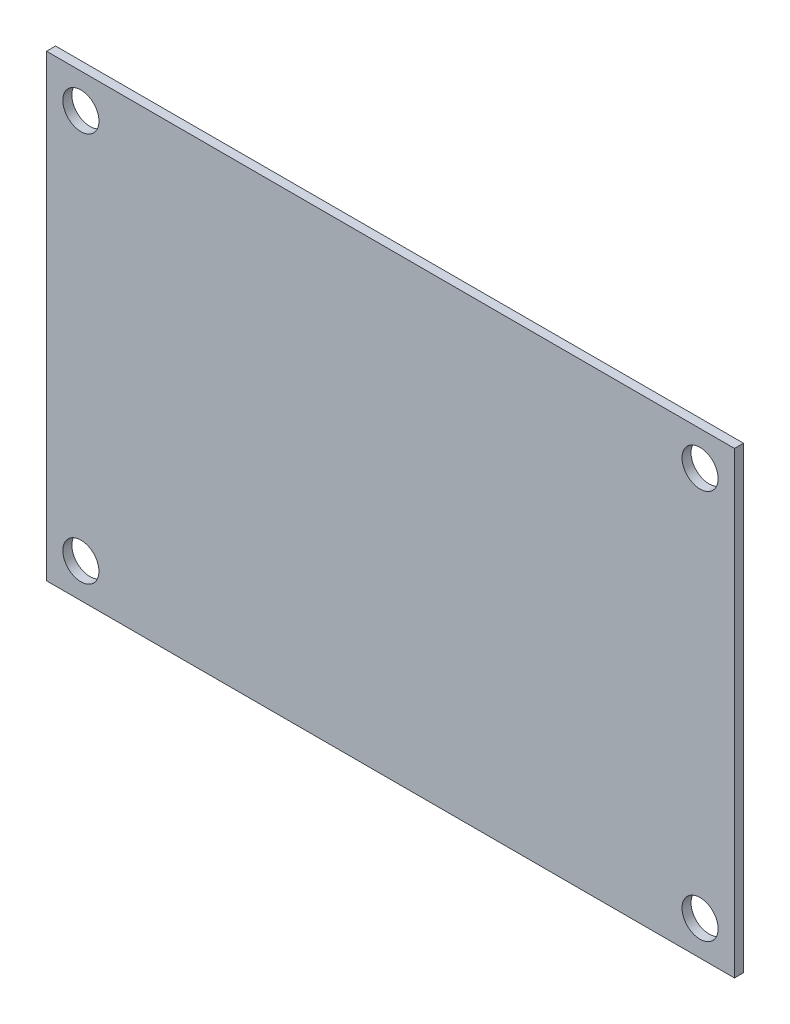
ISO-10303-21;
HEADER;
FILE_DESCRIPTION(('STEP AP214'),'2;1');
FILE_NAME('part.step','',(''),(''),'','','');
FILE_SCHEMA(('AUTOMOTIVE_DESIGN { 1 0 10303 214 1 1 1 1 }'));
ENDSEC;
DATA;
#1=APPLICATION_CONTEXT('core data for automotive mechanical design processes');
#2=APPLICATION_PROTOCOL_DEFINITION('international standard','automotive_design',2000,#1);
#3=PRODUCT_CONTEXT('',#1,'mechanical');
#4=PRODUCT('Part','Part','',(#3));
#5=PRODUCT_RELATED_PRODUCT_CATEGORY('part','',(#4));
#6=PRODUCT_DEFINITION_FORMATION('','',#4);
#7=PRODUCT_DEFINITION_CONTEXT('part definition',#1,'design');
#8=PRODUCT_DEFINITION('design','',#6,#7);
#9=PRODUCT_DEFINITION_SHAPE('','',#8);
#10=(LENGTH_UNIT() NAMED_UNIT(*) SI_UNIT(.MILLI.,.METRE.));
#11=(NAMED_UNIT(*) PLANE_ANGLE_UNIT() SI_UNIT($,.RADIAN.));
#12=(NAMED_UNIT(*) SI_UNIT($,.STERADIAN.) SOLID_ANGLE_UNIT());
#13=UNCERTAINTY_MEASURE_WITH_UNIT(LENGTH_MEASURE(1.E-05),#10,'distance_accuracy_value','');
#14=(GEOMETRIC_REPRESENTATION_CONTEXT(3) GLOBAL_UNCERTAINTY_ASSIGNED_CONTEXT((#13)) GLOBAL_UNIT_ASSIGNED_CONTEXT((#10,
#11,#12)) REPRESENTATION_CONTEXT('',''));
#15=CARTESIAN_POINT('',(0.,0.,0.));
#16=DIRECTION('',(0.,0.,1.));
#17=DIRECTION('',(1.,0.,0.));
#18=AXIS2_PLACEMENT_3D('',#15,#16,#17);
#19=CARTESIAN_POINT('',(0.,0.,1.));
#20=DIRECTION('',(0.,0.,1.));
#21=DIRECTION('',(1.,0.,0.));
#22=AXIS2_PLACEMENT_3D('',#19,#20,#21);
#23=PLANE('',#22);
#24=CARTESIAN_POINT('',(-34.29,-21.59,1.));
#25=DIRECTION('',(0.,0.,1.));
#26=DIRECTION('',(-1.,0.,0.));
#27=AXIS2_PLACEMENT_3D('',#24,#25,#26);
#28=CIRCLE('',#27,2.);
#29=CARTESIAN_POINT('',(-36.29,-21.59,1.));
#30=VERTEX_POINT('',#29);
#31=EDGE_CURVE('E124',#30,#30,#28,.T.);
#32=ORIENTED_EDGE('',*,*,#31,.F.);
#33=EDGE_LOOP('',(#32));
#34=FACE_BOUND('',#33,.T.);
#35=CARTESIAN_POINT('',(-34.29,21.59,1.));
#36=DIRECTION('',(0.,0.,1.));
#37=DIRECTION('',(1.,0.,0.));
#38=AXIS2_PLACEMENT_3D('',#35,#36,#37);
#39=CIRCLE('',#38,2.);
#40=CARTESIAN_POINT('',(-32.29,21.59,1.));
#41=VERTEX_POINT('',#40);
#42=EDGE_CURVE('E103',#41,#41,#39,.T.);
#43=ORIENTED_EDGE('',*,*,#42,.F.);
#44=EDGE_LOOP('',(#43));
#45=FACE_BOUND('',#44,.T.);
#46=DIRECTION('',(0.,-1.,0.));
#47=VECTOR('',#46,1.);
#48=CARTESIAN_POINT('',(-38.1,-25.4,1.));
#49=LINE('',#48,#47);
#50=CARTESIAN_POINT('',(-38.1,25.4,1.));
#51=VERTEX_POINT('',#50);
#52=CARTESIAN_POINT('',(-38.1,-25.4,1.));
#53=VERTEX_POINT('',#52);
#54=EDGE_CURVE('E88',#51,#53,#49,.T.);
#55=ORIENTED_EDGE('',*,*,#54,.T.);
#56=DIRECTION('',(1.,0.,0.));
#57=VECTOR('',#56,1.);
#58=CARTESIAN_POINT('',(38.1,-25.4,1.));
#59=LINE('',#58,#57);
#60=CARTESIAN_POINT('',(38.1,-25.4,1.));
#61=VERTEX_POINT('',#60);
#62=EDGE_CURVE('E83',#53,#61,#59,.T.);
#63=ORIENTED_EDGE('',*,*,#62,.T.);
#64=DIRECTION('',(0.,1.,0.));
#65=VECTOR('',#64,1.);
#66=CARTESIAN_POINT('',(38.1,-25.4,1.));
#67=LINE('',#66,#65);
#68=CARTESIAN_POINT('',(38.1,25.4,1.));
#69=VERTEX_POINT('',#68);
#70=EDGE_CURVE('E86',#61,#69,#67,.T.);
#71=ORIENTED_EDGE('',*,*,#70,.T.);
#72=DIRECTION('',(-1.,0.,0.));
#73=VECTOR('',#72,1.);
#74=CARTESIAN_POINT('',(38.1,25.4,1.));
#75=LINE('',#74,#73);
#76=EDGE_CURVE('E53',#69,#51,#75,.T.);
#77=ORIENTED_EDGE('',*,*,#76,.T.);
#78=EDGE_LOOP('',(#55,#63,#71,#77));
#79=FACE_BOUND('',#78,.T.);
#80=CARTESIAN_POINT('',(34.29,21.59,1.));
#81=DIRECTION('',(0.,0.,1.));
#82=DIRECTION('',(-1.,0.,0.));
#83=AXIS2_PLACEMENT_3D('',#80,#81,#82);
#84=CIRCLE('',#83,2.);
#85=CARTESIAN_POINT('',(32.29,21.59,1.));
#86=VERTEX_POINT('',#85);
#87=EDGE_CURVE('E118',#86,#86,#84,.T.);
#88=ORIENTED_EDGE('',*,*,#87,.F.);
#89=EDGE_LOOP('',(#88));
#90=FACE_BOUND('',#89,.T.);
#91=CARTESIAN_POINT('',(34.29,-21.59,1.));
#92=DIRECTION('',(0.,0.,1.));
#93=DIRECTION('',(1.,0.,0.));
#94=AXIS2_PLACEMENT_3D('',#91,#92,#93);
#95=CIRCLE('',#94,2.);
#96=CARTESIAN_POINT('',(36.29,-21.59,1.));
#97=VERTEX_POINT('',#96);
#98=EDGE_CURVE('E130',#97,#97,#95,.T.);
#99=ORIENTED_EDGE('',*,*,#98,.F.);
#100=EDGE_LOOP('',(#99));
#101=FACE_BOUND('',#100,.T.);
#102=ADVANCED_FACE('F36',(#34,#45,#79,#90,#101),#23,.T.);
#103=CARTESIAN_POINT('',(0.,0.,0.));
#104=DIRECTION('',(0.,0.,1.));
#105=DIRECTION('',(1.,0.,0.));
#106=AXIS2_PLACEMENT_3D('',#103,#104,#105);
#107=PLANE('',#106);
#108=DIRECTION('',(0.,-1.,0.));
#109=VECTOR('',#108,1.);
#110=CARTESIAN_POINT('',(-38.1,-25.4,0.));
#111=LINE('',#110,#109);
#112=CARTESIAN_POINT('',(-38.1,25.4,0.));
#113=VERTEX_POINT('',#112);
#114=CARTESIAN_POINT('',(-38.1,-25.4,0.));
#115=VERTEX_POINT('',#114);
#116=EDGE_CURVE('E100',#113,#115,#111,.T.);
#117=ORIENTED_EDGE('',*,*,#116,.F.);
#118=DIRECTION('',(-1.,0.,0.));
#119=VECTOR('',#118,1.);
#120=CARTESIAN_POINT('',(38.1,25.4,0.));
#121=LINE('',#120,#119);
#122=CARTESIAN_POINT('',(38.1,25.4,0.));
#123=VERTEX_POINT('',#122);
#124=EDGE_CURVE('E76',#123,#113,#121,.T.);
#125=ORIENTED_EDGE('',*,*,#124,.F.);
#126=DIRECTION('',(0.,1.,0.));
#127=VECTOR('',#126,1.);
#128=CARTESIAN_POINT('',(38.1,-25.4,0.));
#129=LINE('',#128,#127);
#130=CARTESIAN_POINT('',(38.1,-25.4,0.));
#131=VERTEX_POINT('',#130);
#132=EDGE_CURVE('E70',#131,#123,#129,.T.);
#133=ORIENTED_EDGE('',*,*,#132,.F.);
#134=DIRECTION('',(1.,0.,0.));
#135=VECTOR('',#134,1.);
#136=CARTESIAN_POINT('',(38.1,-25.4,0.));
#137=LINE('',#136,#135);
#138=EDGE_CURVE('E92',#115,#131,#137,.T.);
#139=ORIENTED_EDGE('',*,*,#138,.F.);
#140=EDGE_LOOP('',(#117,#125,#133,#139));
#141=FACE_BOUND('',#140,.T.);
#142=CARTESIAN_POINT('',(-34.29,21.59,0.));
#143=DIRECTION('',(0.,0.,1.));
#144=DIRECTION('',(1.,0.,0.));
#145=AXIS2_PLACEMENT_3D('',#142,#143,#144);
#146=CIRCLE('',#145,2.);
#147=CARTESIAN_POINT('',(-32.29,21.59,0.));
#148=VERTEX_POINT('',#147);
#149=EDGE_CURVE('E115',#148,#148,#146,.T.);
#150=ORIENTED_EDGE('',*,*,#149,.T.);
#151=EDGE_LOOP('',(#150));
#152=FACE_BOUND('',#151,.T.);
#153=CARTESIAN_POINT('',(34.29,21.59,0.));
#154=DIRECTION('',(0.,0.,1.));
#155=DIRECTION('',(-1.,0.,0.));
#156=AXIS2_PLACEMENT_3D('',#153,#154,#155);
#157=CIRCLE('',#156,2.);
#158=CARTESIAN_POINT('',(32.29,21.59,0.));
#159=VERTEX_POINT('',#158);
#160=EDGE_CURVE('E121',#159,#159,#157,.T.);
#161=ORIENTED_EDGE('',*,*,#160,.T.);
#162=EDGE_LOOP('',(#161));
#163=FACE_BOUND('',#162,.T.);
#164=CARTESIAN_POINT('',(-34.29,-21.59,0.));
#165=DIRECTION('',(0.,0.,1.));
#166=DIRECTION('',(-1.,0.,0.));
#167=AXIS2_PLACEMENT_3D('',#164,#165,#166);
#168=CIRCLE('',#167,2.);
#169=CARTESIAN_POINT('',(-36.29,-21.59,0.));
#170=VERTEX_POINT('',#169);
#171=EDGE_CURVE('E127',#170,#170,#168,.T.);
#172=ORIENTED_EDGE('',*,*,#171,.T.);
#173=EDGE_LOOP('',(#172));
#174=FACE_BOUND('',#173,.T.);
#175=CARTESIAN_POINT('',(34.29,-21.59,0.));
#176=DIRECTION('',(0.,0.,1.));
#177=DIRECTION('',(1.,0.,0.));
#178=AXIS2_PLACEMENT_3D('',#175,#176,#177);
#179=CIRCLE('',#178,2.);
#180=CARTESIAN_POINT('',(36.29,-21.59,0.));
#181=VERTEX_POINT('',#180);
#182=EDGE_CURVE('E133',#181,#181,#179,.T.);
#183=ORIENTED_EDGE('',*,*,#182,.T.);
#184=EDGE_LOOP('',(#183));
#185=FACE_BOUND('',#184,.T.);
#186=ADVANCED_FACE('F111',(#141,#152,#163,#174,#185),#107,.F.);
#187=CARTESIAN_POINT('',(-38.1,-25.4,1.));
#188=DIRECTION('',(1.,0.,0.));
#189=DIRECTION('',(0.,0.,-1.));
#190=AXIS2_PLACEMENT_3D('',#187,#188,#189);
#191=PLANE('',#190);
#192=ORIENTED_EDGE('',*,*,#116,.T.);
#193=DIRECTION('',(0.,0.,-1.));
#194=VECTOR('',#193,1.);
#195=CARTESIAN_POINT('',(-38.1,-25.4,1.));
#196=LINE('',#195,#194);
#197=EDGE_CURVE('E11',#53,#115,#196,.T.);
#198=ORIENTED_EDGE('',*,*,#197,.F.);
#199=ORIENTED_EDGE('',*,*,#54,.F.);
#200=DIRECTION('',(0.,0.,-1.));
#201=VECTOR('',#200,1.);
#202=CARTESIAN_POINT('',(-38.1,25.4,1.));
#203=LINE('',#202,#201);
#204=EDGE_CURVE('E96',#51,#113,#203,.T.);
#205=ORIENTED_EDGE('',*,*,#204,.T.);
#206=EDGE_LOOP('',(#192,#198,#199,#205));
#207=FACE_BOUND('',#206,.T.);
#208=ADVANCED_FACE('F38',(#207),#191,.F.);
#209=CARTESIAN_POINT('',(38.1,-25.4,1.));
#210=DIRECTION('',(0.,1.,0.));
#211=DIRECTION('',(-1.,0.,0.));
#212=AXIS2_PLACEMENT_3D('',#209,#210,#211);
#213=PLANE('',#212);
#214=ORIENTED_EDGE('',*,*,#138,.T.);
#215=DIRECTION('',(0.,0.,-1.));
#216=VECTOR('',#215,1.);
#217=CARTESIAN_POINT('',(38.1,-25.4,1.));
#218=LINE('',#217,#216);
#219=EDGE_CURVE('E45',#61,#131,#218,.T.);
#220=ORIENTED_EDGE('',*,*,#219,.F.);
#221=ORIENTED_EDGE('',*,*,#62,.F.);
#222=ORIENTED_EDGE('',*,*,#197,.T.);
#223=EDGE_LOOP('',(#214,#220,#221,#222));
#224=FACE_BOUND('',#223,.T.);
#225=ADVANCED_FACE('F91',(#224),#213,.F.);
#226=CARTESIAN_POINT('',(38.1,-25.4,1.));
#227=DIRECTION('',(-1.,0.,0.));
#228=DIRECTION('',(0.,0.,1.));
#229=AXIS2_PLACEMENT_3D('',#226,#227,#228);
#230=PLANE('',#229);
#231=ORIENTED_EDGE('',*,*,#132,.T.);
#232=DIRECTION('',(0.,0.,-1.));
#233=VECTOR('',#232,1.);
#234=CARTESIAN_POINT('',(38.1,25.4,1.));
#235=LINE('',#234,#233);
#236=EDGE_CURVE('E93',#69,#123,#235,.T.);
#237=ORIENTED_EDGE('',*,*,#236,.F.);
#238=ORIENTED_EDGE('',*,*,#70,.F.);
#239=ORIENTED_EDGE('',*,*,#219,.T.);
#240=EDGE_LOOP('',(#231,#237,#238,#239));
#241=FACE_BOUND('',#240,.T.);
#242=ADVANCED_FACE('F94',(#241),#230,.F.);
#243=CARTESIAN_POINT('',(38.1,25.4,1.));
#244=DIRECTION('',(0.,-1.,0.));
#245=DIRECTION('',(1.,0.,0.));
#246=AXIS2_PLACEMENT_3D('',#243,#244,#245);
#247=PLANE('',#246);
#248=ORIENTED_EDGE('',*,*,#124,.T.);
#249=ORIENTED_EDGE('',*,*,#204,.F.);
#250=ORIENTED_EDGE('',*,*,#76,.F.);
#251=ORIENTED_EDGE('',*,*,#236,.T.);
#252=EDGE_LOOP('',(#248,#249,#250,#251));
#253=FACE_BOUND('',#252,.T.);
#254=ADVANCED_FACE('F108',(#253),#247,.F.);
#255=CARTESIAN_POINT('',(-34.29,21.59,1.));
#256=DIRECTION('',(0.,0.,-1.));
#257=DIRECTION('',(-1.,0.,0.));
#258=AXIS2_PLACEMENT_3D('',#255,#256,#257);
#259=CYLINDRICAL_SURFACE('',#258,2.);
#260=ORIENTED_EDGE('',*,*,#42,.T.);
#261=EDGE_LOOP('',(#260));
#262=FACE_BOUND('',#261,.T.);
#263=ORIENTED_EDGE('',*,*,#149,.F.);
#264=EDGE_LOOP('',(#263));
#265=FACE_BOUND('',#264,.T.);
#266=ADVANCED_FACE('F152',(#262,#265),#259,.F.);
#267=CARTESIAN_POINT('',(34.29,21.59,1.));
#268=DIRECTION('',(0.,0.,-1.));
#269=DIRECTION('',(-1.,0.,0.));
#270=AXIS2_PLACEMENT_3D('',#267,#268,#269);
#271=CYLINDRICAL_SURFACE('',#270,2.);
#272=ORIENTED_EDGE('',*,*,#87,.T.);
#273=EDGE_LOOP('',(#272));
#274=FACE_BOUND('',#273,.T.);
#275=ORIENTED_EDGE('',*,*,#160,.F.);
#276=EDGE_LOOP('',(#275));
#277=FACE_BOUND('',#276,.T.);
#278=ADVANCED_FACE('F198',(#274,#277),#271,.F.);
#279=CARTESIAN_POINT('',(-34.29,-21.59,1.));
#280=DIRECTION('',(0.,0.,-1.));
#281=DIRECTION('',(-1.,0.,0.));
#282=AXIS2_PLACEMENT_3D('',#279,#280,#281);
#283=CYLINDRICAL_SURFACE('',#282,2.);
#284=ORIENTED_EDGE('',*,*,#31,.T.);
#285=EDGE_LOOP('',(#284));
#286=FACE_BOUND('',#285,.T.);
#287=ORIENTED_EDGE('',*,*,#171,.F.);
#288=EDGE_LOOP('',(#287));
#289=FACE_BOUND('',#288,.T.);
#290=ADVANCED_FACE('F206',(#286,#289),#283,.F.);
#291=CARTESIAN_POINT('',(34.29,-21.59,1.));
#292=DIRECTION('',(0.,0.,-1.));
#293=DIRECTION('',(-1.,0.,0.));
#294=AXIS2_PLACEMENT_3D('',#291,#292,#293);
#295=CYLINDRICAL_SURFACE('',#294,2.);
#296=ORIENTED_EDGE('',*,*,#98,.T.);
#297=EDGE_LOOP('',(#296));
#298=FACE_BOUND('',#297,.T.);
#299=ORIENTED_EDGE('',*,*,#182,.F.);
#300=EDGE_LOOP('',(#299));
#301=FACE_BOUND('',#300,.T.);
#302=ADVANCED_FACE('F139',(#298,#301),#295,.F.);
#303=CLOSED_SHELL('',(#102,#186,#208,#225,#242,#254,#266,#278,#290,#302));
#304=MANIFOLD_SOLID_BREP('B2',#303);
#305=ADVANCED_BREP_SHAPE_REPRESENTATION('',(#18,#304),#14);
#306=SHAPE_DEFINITION_REPRESENTATION(#9,#305);
ENDSEC;
END-ISO-10303-21;
